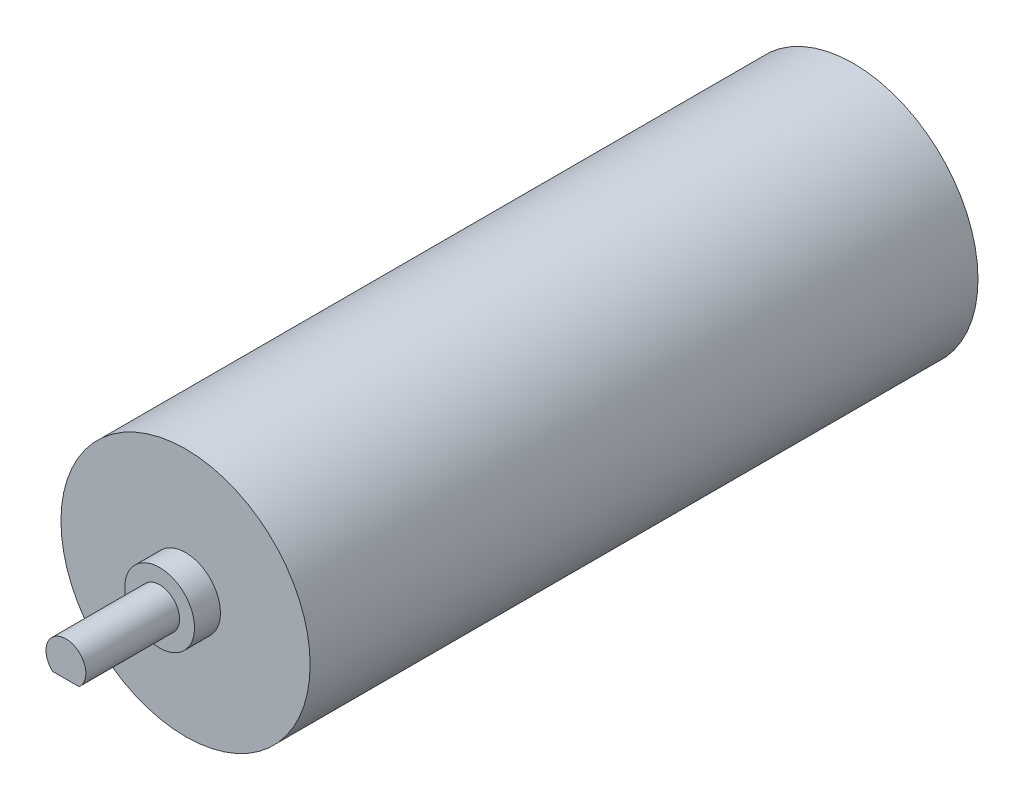
ISO-10303-21;
HEADER;
FILE_DESCRIPTION(('STEP AP214'),'2;1');
FILE_NAME('part.step','',(''),(''),'','','');
FILE_SCHEMA(('AUTOMOTIVE_DESIGN { 1 0 10303 214 1 1 1 1 }'));
ENDSEC;
DATA;
#1=APPLICATION_CONTEXT('core data for automotive mechanical design processes');
#2=APPLICATION_PROTOCOL_DEFINITION('international standard','automotive_design',2000,#1);
#3=PRODUCT_CONTEXT('',#1,'mechanical');
#4=PRODUCT('Part','Part','',(#3));
#5=PRODUCT_RELATED_PRODUCT_CATEGORY('part','',(#4));
#6=PRODUCT_DEFINITION_FORMATION('','',#4);
#7=PRODUCT_DEFINITION_CONTEXT('part definition',#1,'design');
#8=PRODUCT_DEFINITION('design','',#6,#7);
#9=PRODUCT_DEFINITION_SHAPE('','',#8);
#10=(LENGTH_UNIT() NAMED_UNIT(*) SI_UNIT(.MILLI.,.METRE.));
#11=(NAMED_UNIT(*) PLANE_ANGLE_UNIT() SI_UNIT($,.RADIAN.));
#12=(NAMED_UNIT(*) SI_UNIT($,.STERADIAN.) SOLID_ANGLE_UNIT());
#13=UNCERTAINTY_MEASURE_WITH_UNIT(LENGTH_MEASURE(1.E-05),#10,'distance_accuracy_value','');
#14=(GEOMETRIC_REPRESENTATION_CONTEXT(3) GLOBAL_UNCERTAINTY_ASSIGNED_CONTEXT((#13)) GLOBAL_UNIT_ASSIGNED_CONTEXT((#10,
#11,#12)) REPRESENTATION_CONTEXT('',''));
#15=CARTESIAN_POINT('',(0.,0.,0.));
#16=DIRECTION('',(0.,0.,1.));
#17=DIRECTION('',(1.,0.,0.));
#18=AXIS2_PLACEMENT_3D('',#15,#16,#17);
#19=CARTESIAN_POINT('',(0.,0.,-9.4));
#20=DIRECTION('',(0.,0.,1.));
#21=DIRECTION('',(1.,0.,0.));
#22=AXIS2_PLACEMENT_3D('',#19,#20,#21);
#23=CYLINDRICAL_SURFACE('',#22,2.);
#24=DIRECTION('',(0.,0.,1.));
#25=VECTOR('',#24,1.);
#26=CARTESIAN_POINT('',(-1.3228756555323,-1.5,-9.4));
#27=LINE('',#26,#25);
#28=CARTESIAN_POINT('',(-1.3228756555323,-1.5,0.));
#29=VERTEX_POINT('',#28);
#30=CARTESIAN_POINT('',(-1.3228756555323,-1.5,-8.));
#31=VERTEX_POINT('',#30);
#32=EDGE_CURVE('E71',#29,#31,#27,.F.);
#33=ORIENTED_EDGE('',*,*,#32,.F.);
#34=CARTESIAN_POINT('',(0.,0.,0.));
#35=DIRECTION('',(0.,0.,1.));
#36=DIRECTION('',(1.,0.,0.));
#37=AXIS2_PLACEMENT_3D('',#34,#35,#36);
#38=CIRCLE('',#37,2.);
#39=CARTESIAN_POINT('',(1.3228756555323,-1.5,0.));
#40=VERTEX_POINT('',#39);
#41=EDGE_CURVE('E83',#40,#29,#38,.T.);
#42=ORIENTED_EDGE('',*,*,#41,.F.);
#43=DIRECTION('',(0.,0.,1.));
#44=VECTOR('',#43,1.);
#45=CARTESIAN_POINT('',(1.3228756555323,-1.5,-9.4));
#46=LINE('',#45,#44);
#47=CARTESIAN_POINT('',(1.3228756555323,-1.5,-8.));
#48=VERTEX_POINT('',#47);
#49=EDGE_CURVE('E66',#48,#40,#46,.T.);
#50=ORIENTED_EDGE('',*,*,#49,.F.);
#51=CARTESIAN_POINT('',(0.,0.,-8.));
#52=DIRECTION('',(0.,0.,1.));
#53=DIRECTION('',(1.,0.,0.));
#54=AXIS2_PLACEMENT_3D('',#51,#52,#53);
#55=CIRCLE('',#54,2.);
#56=EDGE_CURVE('E58',#48,#31,#55,.F.);
#57=ORIENTED_EDGE('',*,*,#56,.T.);
#58=EDGE_LOOP('',(#33,#42,#50,#57));
#59=FACE_BOUND('',#58,.T.);
#60=CARTESIAN_POINT('',(0.,0.,-9.4));
#61=DIRECTION('',(0.,0.,1.));
#62=DIRECTION('',(1.,0.,0.));
#63=AXIS2_PLACEMENT_3D('',#60,#61,#62);
#64=CIRCLE('',#63,2.);
#65=CARTESIAN_POINT('',(2.,0.,-9.4));
#66=VERTEX_POINT('',#65);
#67=EDGE_CURVE('E94',#66,#66,#64,.T.);
#68=ORIENTED_EDGE('',*,*,#67,.T.);
#69=EDGE_LOOP('',(#68));
#70=FACE_BOUND('',#69,.T.);
#71=ADVANCED_FACE('F48',(#59,#70),#23,.T.);
#72=CARTESIAN_POINT('',(0.,0.,0.));
#73=DIRECTION('',(0.,0.,1.));
#74=DIRECTION('',(1.,0.,0.));
#75=AXIS2_PLACEMENT_3D('',#72,#73,#74);
#76=PLANE('',#75);
#77=DIRECTION('',(-1.,0.,0.));
#78=VECTOR('',#77,1.);
#79=CARTESIAN_POINT('',(0.,-1.5,0.));
#80=LINE('',#79,#78);
#81=EDGE_CURVE('E77',#40,#29,#80,.T.);
#82=ORIENTED_EDGE('',*,*,#81,.F.);
#83=ORIENTED_EDGE('',*,*,#41,.T.);
#84=EDGE_LOOP('',(#82,#83));
#85=FACE_BOUND('',#84,.T.);
#86=ADVANCED_FACE('F90',(#85),#76,.T.);
#87=CARTESIAN_POINT('',(-2.64100058965119,-1.5,-8.));
#88=DIRECTION('',(0.,1.,0.));
#89=DIRECTION('',(0.,0.,1.));
#90=AXIS2_PLACEMENT_3D('',#87,#88,#89);
#91=PLANE('',#90);
#92=ORIENTED_EDGE('',*,*,#32,.T.);
#93=DIRECTION('',(-1.,0.,0.));
#94=VECTOR('',#93,1.);
#95=CARTESIAN_POINT('',(-2.64100058965119,-1.5,-8.));
#96=LINE('',#95,#94);
#97=EDGE_CURVE('E98',#48,#31,#96,.T.);
#98=ORIENTED_EDGE('',*,*,#97,.F.);
#99=ORIENTED_EDGE('',*,*,#49,.T.);
#100=ORIENTED_EDGE('',*,*,#81,.T.);
#101=EDGE_LOOP('',(#92,#98,#99,#100));
#102=FACE_BOUND('',#101,.T.);
#103=ADVANCED_FACE('F78',(#102),#91,.F.);
#104=CARTESIAN_POINT('',(0.,0.,-8.));
#105=DIRECTION('',(0.,0.,1.));
#106=DIRECTION('',(1.,0.,0.));
#107=AXIS2_PLACEMENT_3D('',#104,#105,#106);
#108=PLANE('',#107);
#109=ORIENTED_EDGE('',*,*,#97,.T.);
#110=ORIENTED_EDGE('',*,*,#56,.F.);
#111=EDGE_LOOP('',(#109,#110));
#112=FACE_BOUND('',#111,.T.);
#113=ADVANCED_FACE('F162',(#112),#108,.T.);
#114=CARTESIAN_POINT('',(0.,0.,-12.));
#115=DIRECTION('',(0.,0.,1.));
#116=DIRECTION('',(1.,0.,0.));
#117=AXIS2_PLACEMENT_3D('',#114,#115,#116);
#118=CYLINDRICAL_SURFACE('',#117,3.5);
#119=CARTESIAN_POINT('',(0.,0.,-12.));
#120=DIRECTION('',(0.,0.,-1.));
#121=DIRECTION('',(-1.,0.,0.));
#122=AXIS2_PLACEMENT_3D('',#119,#120,#121);
#123=CIRCLE('',#122,3.5);
#124=CARTESIAN_POINT('',(-3.5,0.,-12.));
#125=VERTEX_POINT('',#124);
#126=EDGE_CURVE('E99',#125,#125,#123,.T.);
#127=ORIENTED_EDGE('',*,*,#126,.F.);
#128=EDGE_LOOP('',(#127));
#129=FACE_BOUND('',#128,.T.);
#130=CARTESIAN_POINT('',(0.,0.,-9.4));
#131=DIRECTION('',(0.,0.,-1.));
#132=DIRECTION('',(-1.,0.,0.));
#133=AXIS2_PLACEMENT_3D('',#130,#131,#132);
#134=CIRCLE('',#133,3.5);
#135=CARTESIAN_POINT('',(-3.5,0.,-9.4));
#136=VERTEX_POINT('',#135);
#137=EDGE_CURVE('E105',#136,#136,#134,.T.);
#138=ORIENTED_EDGE('',*,*,#137,.T.);
#139=EDGE_LOOP('',(#138));
#140=FACE_BOUND('',#139,.T.);
#141=ADVANCED_FACE('F158',(#129,#140),#118,.T.);
#142=CARTESIAN_POINT('',(0.,0.,-9.4));
#143=DIRECTION('',(0.,0.,-1.));
#144=DIRECTION('',(-1.,0.,0.));
#145=AXIS2_PLACEMENT_3D('',#142,#143,#144);
#146=PLANE('',#145);
#147=ORIENTED_EDGE('',*,*,#67,.F.);
#148=EDGE_LOOP('',(#147));
#149=FACE_BOUND('',#148,.T.);
#150=ORIENTED_EDGE('',*,*,#137,.F.);
#151=EDGE_LOOP('',(#150));
#152=FACE_BOUND('',#151,.T.);
#153=ADVANCED_FACE('F154',(#149,#152),#146,.F.);
#154=CARTESIAN_POINT('',(0.,0.,-12.1));
#155=DIRECTION('',(0.,0.,1.));
#156=DIRECTION('',(1.,0.,0.));
#157=AXIS2_PLACEMENT_3D('',#154,#155,#156);
#158=CYLINDRICAL_SURFACE('',#157,12.5);
#159=CARTESIAN_POINT('',(0.,0.,-79.));
#160=DIRECTION('',(0.,0.,-1.));
#161=DIRECTION('',(-1.,0.,0.));
#162=AXIS2_PLACEMENT_3D('',#159,#160,#161);
#163=CIRCLE('',#162,12.5);
#164=CARTESIAN_POINT('',(-12.5,0.,-79.));
#165=VERTEX_POINT('',#164);
#166=EDGE_CURVE('E115',#165,#165,#163,.T.);
#167=ORIENTED_EDGE('',*,*,#166,.F.);
#168=EDGE_LOOP('',(#167));
#169=FACE_BOUND('',#168,.T.);
#170=CARTESIAN_POINT('',(0.,0.,-12.));
#171=DIRECTION('',(0.,0.,-1.));
#172=DIRECTION('',(-1.,0.,0.));
#173=AXIS2_PLACEMENT_3D('',#170,#171,#172);
#174=CIRCLE('',#173,12.5);
#175=CARTESIAN_POINT('',(-12.5,0.,-12.));
#176=VERTEX_POINT('',#175);
#177=EDGE_CURVE('E109',#176,#176,#174,.T.);
#178=ORIENTED_EDGE('',*,*,#177,.T.);
#179=EDGE_LOOP('',(#178));
#180=FACE_BOUND('',#179,.T.);
#181=ADVANCED_FACE('F150',(#169,#180),#158,.T.);
#182=CARTESIAN_POINT('',(0.,0.,-12.));
#183=DIRECTION('',(0.,0.,-1.));
#184=DIRECTION('',(-1.,0.,0.));
#185=AXIS2_PLACEMENT_3D('',#182,#183,#184);
#186=PLANE('',#185);
#187=ORIENTED_EDGE('',*,*,#177,.F.);
#188=EDGE_LOOP('',(#187));
#189=FACE_BOUND('',#188,.T.);
#190=ORIENTED_EDGE('',*,*,#126,.T.);
#191=EDGE_LOOP('',(#190));
#192=FACE_BOUND('',#191,.T.);
#193=ADVANCED_FACE('F147',(#189,#192),#186,.F.);
#194=CARTESIAN_POINT('',(0.,0.,-79.));
#195=DIRECTION('',(0.,0.,-1.));
#196=DIRECTION('',(-1.,0.,0.));
#197=AXIS2_PLACEMENT_3D('',#194,#195,#196);
#198=PLANE('',#197);
#199=ORIENTED_EDGE('',*,*,#166,.T.);
#200=EDGE_LOOP('',(#199));
#201=FACE_BOUND('',#200,.T.);
#202=ADVANCED_FACE('F146',(#201),#198,.T.);
#203=CLOSED_SHELL('',(#71,#86,#103,#113,#141,#153,#181,#193,#202));
#204=CARTESIAN_POINT('',(0.,0.,-12.1));
#205=DIRECTION('',(0.,0.,-1.));
#206=DIRECTION('',(-1.,0.,0.));
#207=AXIS2_PLACEMENT_3D('',#204,#205,#206);
#208=PLANE('',#207);
#209=CARTESIAN_POINT('',(0.,0.,-12.1));
#210=DIRECTION('',(0.,0.,-1.));
#211=DIRECTION('',(-1.,0.,0.));
#212=AXIS2_PLACEMENT_3D('',#209,#210,#211);
#213=CIRCLE('',#212,12.4);
#214=CARTESIAN_POINT('',(-12.4,0.,-12.1));
#215=VERTEX_POINT('',#214);
#216=EDGE_CURVE('E12',#215,#215,#213,.F.);
#217=ORIENTED_EDGE('',*,*,#216,.F.);
#218=EDGE_LOOP('',(#217));
#219=FACE_BOUND('',#218,.T.);
#220=ADVANCED_FACE('F134',(#219),#208,.T.);
#221=CARTESIAN_POINT('',(0.,0.,-79.));
#222=DIRECTION('',(0.,0.,1.));
#223=DIRECTION('',(1.,0.,0.));
#224=AXIS2_PLACEMENT_3D('',#221,#222,#223);
#225=CYLINDRICAL_SURFACE('',#224,12.4);
#226=ORIENTED_EDGE('',*,*,#216,.T.);
#227=EDGE_LOOP('',(#226));
#228=FACE_BOUND('',#227,.T.);
#229=CARTESIAN_POINT('',(0.,0.,-78.9));
#230=DIRECTION('',(0.,0.,-1.));
#231=DIRECTION('',(-1.,0.,0.));
#232=AXIS2_PLACEMENT_3D('',#229,#230,#231);
#233=CIRCLE('',#232,12.4);
#234=CARTESIAN_POINT('',(-12.4,0.,-78.9));
#235=VERTEX_POINT('',#234);
#236=EDGE_CURVE('E51',#235,#235,#233,.T.);
#237=ORIENTED_EDGE('',*,*,#236,.T.);
#238=EDGE_LOOP('',(#237));
#239=FACE_BOUND('',#238,.T.);
#240=ADVANCED_FACE('F125',(#228,#239),#225,.F.);
#241=CARTESIAN_POINT('',(0.,0.,-78.9));
#242=DIRECTION('',(0.,0.,-1.));
#243=DIRECTION('',(-1.,0.,0.));
#244=AXIS2_PLACEMENT_3D('',#241,#242,#243);
#245=PLANE('',#244);
#246=ORIENTED_EDGE('',*,*,#236,.F.);
#247=EDGE_LOOP('',(#246));
#248=FACE_BOUND('',#247,.T.);
#249=ADVANCED_FACE('F127',(#248),#245,.F.);
#250=CLOSED_SHELL('',(#220,#240,#249));
#251=ORIENTED_CLOSED_SHELL('',*,#250,.T.);
#252=BREP_WITH_VOIDS('B2',#203,(#251));
#253=ADVANCED_BREP_SHAPE_REPRESENTATION('',(#18,#252),#14);
#254=SHAPE_DEFINITION_REPRESENTATION(#9,#253);
ENDSEC;
END-ISO-10303-21;
